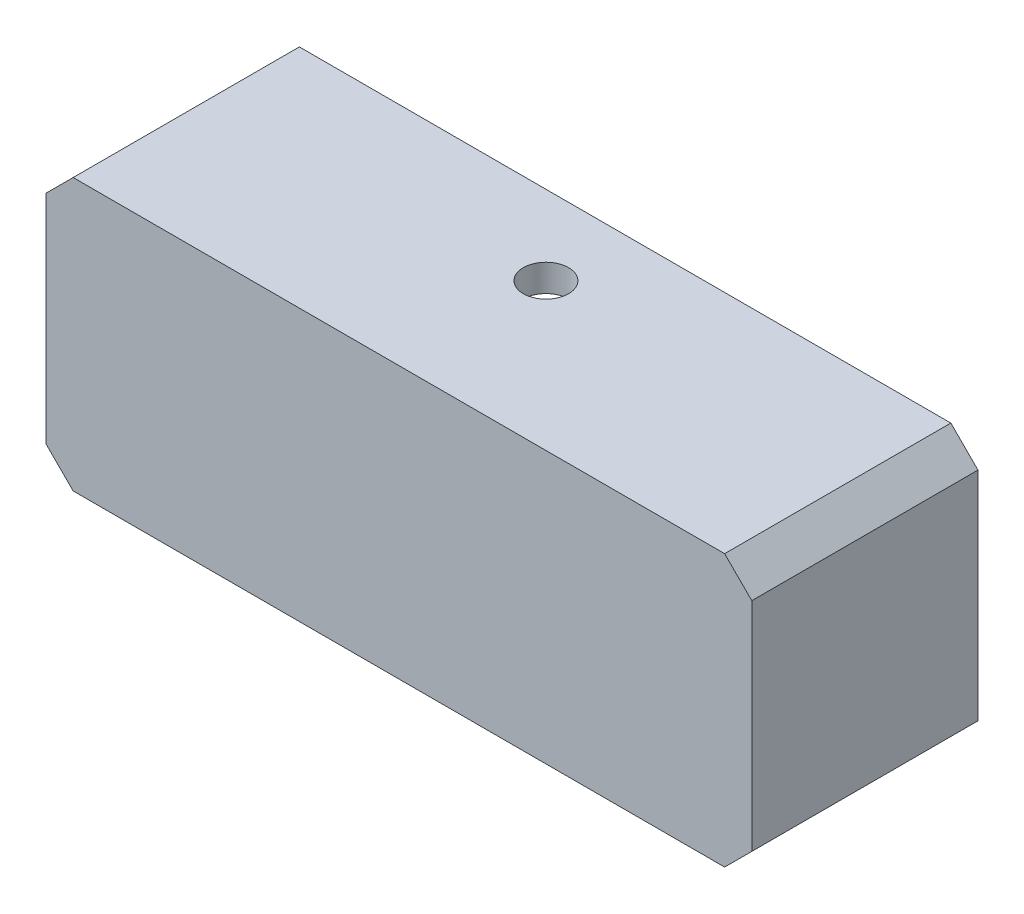
ISO-10303-21;
HEADER;
FILE_DESCRIPTION(('STEP AP214'),'2;1');
FILE_NAME('part.step','',(''),(''),'','','');
FILE_SCHEMA(('AUTOMOTIVE_DESIGN { 1 0 10303 214 1 1 1 1 }'));
ENDSEC;
DATA;
#1=APPLICATION_CONTEXT('core data for automotive mechanical design processes');
#2=APPLICATION_PROTOCOL_DEFINITION('international standard','automotive_design',2000,#1);
#3=PRODUCT_CONTEXT('',#1,'mechanical');
#4=PRODUCT('Part','Part','',(#3));
#5=PRODUCT_RELATED_PRODUCT_CATEGORY('part','',(#4));
#6=PRODUCT_DEFINITION_FORMATION('','',#4);
#7=PRODUCT_DEFINITION_CONTEXT('part definition',#1,'design');
#8=PRODUCT_DEFINITION('design','',#6,#7);
#9=PRODUCT_DEFINITION_SHAPE('','',#8);
#10=(LENGTH_UNIT() NAMED_UNIT(*) SI_UNIT(.MILLI.,.METRE.));
#11=(NAMED_UNIT(*) PLANE_ANGLE_UNIT() SI_UNIT($,.RADIAN.));
#12=(NAMED_UNIT(*) SI_UNIT($,.STERADIAN.) SOLID_ANGLE_UNIT());
#13=UNCERTAINTY_MEASURE_WITH_UNIT(LENGTH_MEASURE(1.E-05),#10,'distance_accuracy_value','');
#14=(GEOMETRIC_REPRESENTATION_CONTEXT(3) GLOBAL_UNCERTAINTY_ASSIGNED_CONTEXT((#13)) GLOBAL_UNIT_ASSIGNED_CONTEXT((#10,
#11,#12)) REPRESENTATION_CONTEXT('',''));
#15=CARTESIAN_POINT('',(0.,0.,0.));
#16=DIRECTION('',(0.,0.,1.));
#17=DIRECTION('',(1.,0.,0.));
#18=AXIS2_PLACEMENT_3D('',#15,#16,#17);
#19=CARTESIAN_POINT('',(0.,0.,0.));
#20=DIRECTION('',(0.,0.,-1.));
#21=DIRECTION('',(-1.,0.,0.));
#22=AXIS2_PLACEMENT_3D('',#19,#20,#21);
#23=PLANE('',#22);
#24=DIRECTION('',(-1.,0.,0.));
#25=VECTOR('',#24,1.);
#26=CARTESIAN_POINT('',(-1.,24.,0.));
#27=LINE('',#26,#25);
#28=CARTESIAN_POINT('',(71.,24.,0.));
#29=VERTEX_POINT('',#28);
#30=CARTESIAN_POINT('',(-1.,24.,0.));
#31=VERTEX_POINT('',#30);
#32=EDGE_CURVE('E243',#29,#31,#27,.T.);
#33=ORIENTED_EDGE('',*,*,#32,.F.);
#34=DIRECTION('',(0.,1.,0.));
#35=VECTOR('',#34,1.);
#36=CARTESIAN_POINT('',(71.,8.99999999999999,0.));
#37=LINE('',#36,#35);
#38=CARTESIAN_POINT('',(71.,9.00000000000001,0.));
#39=VERTEX_POINT('',#38);
#40=EDGE_CURVE('E227',#39,#29,#37,.T.);
#41=ORIENTED_EDGE('',*,*,#40,.F.);
#42=DIRECTION('',(1.,0.,0.));
#43=VECTOR('',#42,1.);
#44=CARTESIAN_POINT('',(58.0000000000001,9.00000000000001,0.));
#45=LINE('',#44,#43);
#46=CARTESIAN_POINT('',(58.0000000000001,9.00000000000001,0.));
#47=VERTEX_POINT('',#46);
#48=EDGE_CURVE('E340',#47,#39,#45,.T.);
#49=ORIENTED_EDGE('',*,*,#48,.F.);
#50=DIRECTION('',(0.,1.,0.));
#51=VECTOR('',#50,1.);
#52=CARTESIAN_POINT('',(58.0000000000001,-3.,0.));
#53=LINE('',#52,#51);
#54=CARTESIAN_POINT('',(58.0000000000001,0.,0.));
#55=VERTEX_POINT('',#54);
#56=EDGE_CURVE('E343',#55,#47,#53,.T.);
#57=ORIENTED_EDGE('',*,*,#56,.F.);
#58=DIRECTION('',(1.,0.,0.));
#59=VECTOR('',#58,1.);
#60=CARTESIAN_POINT('',(11.9999999999999,0.,0.));
#61=LINE('',#60,#59);
#62=CARTESIAN_POINT('',(11.9999999999999,0.,0.));
#63=VERTEX_POINT('',#62);
#64=EDGE_CURVE('E252',#63,#55,#61,.T.);
#65=ORIENTED_EDGE('',*,*,#64,.F.);
#66=DIRECTION('',(0.,1.,0.));
#67=VECTOR('',#66,1.);
#68=CARTESIAN_POINT('',(11.9999999999999,-3.,0.));
#69=LINE('',#68,#67);
#70=CARTESIAN_POINT('',(11.9999999999999,9.,0.));
#71=VERTEX_POINT('',#70);
#72=EDGE_CURVE('E299',#63,#71,#69,.T.);
#73=ORIENTED_EDGE('',*,*,#72,.T.);
#74=DIRECTION('',(-1.,0.,0.));
#75=VECTOR('',#74,1.);
#76=CARTESIAN_POINT('',(11.9999999999999,9.,0.));
#77=LINE('',#76,#75);
#78=CARTESIAN_POINT('',(-1.,9.,0.));
#79=VERTEX_POINT('',#78);
#80=EDGE_CURVE('E295',#71,#79,#77,.T.);
#81=ORIENTED_EDGE('',*,*,#80,.T.);
#82=DIRECTION('',(0.,-1.,0.));
#83=VECTOR('',#82,1.);
#84=CARTESIAN_POINT('',(-1.,9.,0.));
#85=LINE('',#84,#83);
#86=EDGE_CURVE('E246',#31,#79,#85,.T.);
#87=ORIENTED_EDGE('',*,*,#86,.F.);
#88=EDGE_LOOP('',(#33,#41,#49,#57,#65,#73,#81,#87));
#89=FACE_BOUND('',#88,.T.);
#90=ADVANCED_FACE('F45',(#89),#23,.T.);
#91=CARTESIAN_POINT('',(58.0000000000001,9.00000000000001,-22.));
#92=DIRECTION('',(0.,-1.,0.));
#93=DIRECTION('',(1.,0.,0.));
#94=AXIS2_PLACEMENT_3D('',#91,#92,#93);
#95=PLANE('',#94);
#96=CARTESIAN_POINT('',(65.4500000000001,9.00000000000001,-8.));
#97=DIRECTION('',(0.,-1.,0.));
#98=DIRECTION('',(1.,0.,0.));
#99=AXIS2_PLACEMENT_3D('',#96,#97,#98);
#100=CIRCLE('',#99,1.65);
#101=CARTESIAN_POINT('',(67.1000000000001,9.00000000000001,-8.));
#102=VERTEX_POINT('',#101);
#103=EDGE_CURVE('E404',#102,#102,#100,.T.);
#104=ORIENTED_EDGE('',*,*,#103,.T.);
#105=EDGE_LOOP('',(#104));
#106=FACE_BOUND('',#105,.T.);
#107=DIRECTION('',(0.,0.,1.));
#108=VECTOR('',#107,1.);
#109=CARTESIAN_POINT('',(71.,8.99999999999999,-22.));
#110=LINE('',#109,#108);
#111=CARTESIAN_POINT('',(71.,9.00000000000001,-22.));
#112=VERTEX_POINT('',#111);
#113=EDGE_CURVE('E230',#112,#39,#110,.T.);
#114=ORIENTED_EDGE('',*,*,#113,.F.);
#115=DIRECTION('',(1.,0.,0.));
#116=VECTOR('',#115,1.);
#117=CARTESIAN_POINT('',(58.0000000000001,9.00000000000001,-22.));
#118=LINE('',#117,#116);
#119=CARTESIAN_POINT('',(58.0000000000001,9.00000000000001,-22.));
#120=VERTEX_POINT('',#119);
#121=EDGE_CURVE('E218',#120,#112,#118,.T.);
#122=ORIENTED_EDGE('',*,*,#121,.F.);
#123=DIRECTION('',(0.,0.,1.));
#124=VECTOR('',#123,1.);
#125=CARTESIAN_POINT('',(58.0000000000001,9.00000000000001,-22.));
#126=LINE('',#125,#124);
#127=EDGE_CURVE('E349',#120,#47,#126,.T.);
#128=ORIENTED_EDGE('',*,*,#127,.T.);
#129=ORIENTED_EDGE('',*,*,#48,.T.);
#130=EDGE_LOOP('',(#114,#122,#128,#129));
#131=FACE_BOUND('',#130,.T.);
#132=ADVANCED_FACE('F479',(#106,#131),#95,.F.);
#133=CARTESIAN_POINT('',(11.9999999999999,9.,-22.));
#134=DIRECTION('',(0.,1.,0.));
#135=DIRECTION('',(-1.,0.,0.));
#136=AXIS2_PLACEMENT_3D('',#133,#134,#135);
#137=PLANE('',#136);
#138=CARTESIAN_POINT('',(4.54999999999994,9.,-8.));
#139=DIRECTION('',(0.,1.,0.));
#140=DIRECTION('',(-1.,0.,0.));
#141=AXIS2_PLACEMENT_3D('',#138,#139,#140);
#142=CIRCLE('',#141,1.65);
#143=CARTESIAN_POINT('',(2.89999999999994,9.,-8.));
#144=VERTEX_POINT('',#143);
#145=EDGE_CURVE('E422',#144,#144,#142,.F.);
#146=ORIENTED_EDGE('',*,*,#145,.T.);
#147=EDGE_LOOP('',(#146));
#148=FACE_BOUND('',#147,.T.);
#149=DIRECTION('',(-1.,0.,0.));
#150=VECTOR('',#149,1.);
#151=CARTESIAN_POINT('',(11.9999999999999,9.,-22.));
#152=LINE('',#151,#150);
#153=CARTESIAN_POINT('',(11.9999999999999,9.,-22.));
#154=VERTEX_POINT('',#153);
#155=CARTESIAN_POINT('',(-1.,9.,-22.));
#156=VERTEX_POINT('',#155);
#157=EDGE_CURVE('E296',#154,#156,#152,.T.);
#158=ORIENTED_EDGE('',*,*,#157,.T.);
#159=DIRECTION('',(0.,0.,1.));
#160=VECTOR('',#159,1.);
#161=CARTESIAN_POINT('',(-1.,9.,-22.));
#162=LINE('',#161,#160);
#163=EDGE_CURVE('E238',#156,#79,#162,.T.);
#164=ORIENTED_EDGE('',*,*,#163,.T.);
#165=ORIENTED_EDGE('',*,*,#80,.F.);
#166=DIRECTION('',(0.,0.,1.));
#167=VECTOR('',#166,1.);
#168=CARTESIAN_POINT('',(11.9999999999999,9.,-22.));
#169=LINE('',#168,#167);
#170=EDGE_CURVE('E304',#154,#71,#169,.T.);
#171=ORIENTED_EDGE('',*,*,#170,.F.);
#172=EDGE_LOOP('',(#158,#164,#165,#171));
#173=FACE_BOUND('',#172,.T.);
#174=ADVANCED_FACE('F489',(#148,#173),#137,.T.);
#175=CARTESIAN_POINT('',(58.0000000000001,-3.,-22.));
#176=DIRECTION('',(1.,0.,0.));
#177=DIRECTION('',(0.,0.,-1.));
#178=AXIS2_PLACEMENT_3D('',#175,#176,#177);
#179=PLANE('',#178);
#180=DIRECTION('',(0.,0.,1.));
#181=VECTOR('',#180,1.);
#182=CARTESIAN_POINT('',(58.0000000000001,0.,-22.));
#183=LINE('',#182,#181);
#184=CARTESIAN_POINT('',(58.0000000000001,0.,-22.));
#185=VERTEX_POINT('',#184);
#186=EDGE_CURVE('E256',#185,#55,#183,.T.);
#187=ORIENTED_EDGE('',*,*,#186,.T.);
#188=ORIENTED_EDGE('',*,*,#56,.T.);
#189=ORIENTED_EDGE('',*,*,#127,.F.);
#190=DIRECTION('',(0.,1.,0.));
#191=VECTOR('',#190,1.);
#192=CARTESIAN_POINT('',(58.0000000000001,-3.,-22.));
#193=LINE('',#192,#191);
#194=EDGE_CURVE('E347',#185,#120,#193,.T.);
#195=ORIENTED_EDGE('',*,*,#194,.F.);
#196=EDGE_LOOP('',(#187,#188,#189,#195));
#197=FACE_BOUND('',#196,.T.);
#198=ADVANCED_FACE('F540',(#197),#179,.F.);
#199=CARTESIAN_POINT('',(11.9999999999999,-3.,-22.));
#200=DIRECTION('',(1.,0.,0.));
#201=DIRECTION('',(0.,1.,0.));
#202=AXIS2_PLACEMENT_3D('',#199,#200,#201);
#203=PLANE('',#202);
#204=ORIENTED_EDGE('',*,*,#72,.F.);
#205=DIRECTION('',(0.,0.,1.));
#206=VECTOR('',#205,1.);
#207=CARTESIAN_POINT('',(11.9999999999999,0.,-22.));
#208=LINE('',#207,#206);
#209=CARTESIAN_POINT('',(11.9999999999999,0.,-22.));
#210=VERTEX_POINT('',#209);
#211=EDGE_CURVE('E260',#210,#63,#208,.T.);
#212=ORIENTED_EDGE('',*,*,#211,.F.);
#213=DIRECTION('',(0.,1.,0.));
#214=VECTOR('',#213,1.);
#215=CARTESIAN_POINT('',(11.9999999999999,-3.,-22.));
#216=LINE('',#215,#214);
#217=EDGE_CURVE('E298',#210,#154,#216,.T.);
#218=ORIENTED_EDGE('',*,*,#217,.T.);
#219=ORIENTED_EDGE('',*,*,#170,.T.);
#220=EDGE_LOOP('',(#204,#212,#218,#219));
#221=FACE_BOUND('',#220,.T.);
#222=ADVANCED_FACE('F475',(#221),#203,.T.);
#223=CARTESIAN_POINT('',(-4.,27.,0.));
#224=DIRECTION('',(-1.,0.,0.));
#225=DIRECTION('',(0.,-1.,0.));
#226=AXIS2_PLACEMENT_3D('',#223,#224,#225);
#227=PLANE('',#226);
#228=DIRECTION('',(0.,-1.,0.));
#229=VECTOR('',#228,1.);
#230=CARTESIAN_POINT('',(-4.,27.,3.));
#231=LINE('',#230,#229);
#232=CARTESIAN_POINT('',(-4.,24.,3.));
#233=VERTEX_POINT('',#232);
#234=CARTESIAN_POINT('',(-4.,0.,3.));
#235=VERTEX_POINT('',#234);
#236=EDGE_CURVE('E355',#233,#235,#231,.T.);
#237=ORIENTED_EDGE('',*,*,#236,.F.);
#238=DIRECTION('',(0.,0.,-1.));
#239=VECTOR('',#238,1.);
#240=CARTESIAN_POINT('',(-4.,24.,0.));
#241=LINE('',#240,#239);
#242=CARTESIAN_POINT('',(-4.00000000000001,24.,-22.));
#243=VERTEX_POINT('',#242);
#244=EDGE_CURVE('E383',#233,#243,#241,.T.);
#245=ORIENTED_EDGE('',*,*,#244,.T.);
#246=DIRECTION('',(0.,-1.,0.));
#247=VECTOR('',#246,1.);
#248=CARTESIAN_POINT('',(-4.,9.,-22.));
#249=LINE('',#248,#247);
#250=CARTESIAN_POINT('',(-4.,0.,-22.));
#251=VERTEX_POINT('',#250);
#252=EDGE_CURVE('E301',#243,#251,#249,.T.);
#253=ORIENTED_EDGE('',*,*,#252,.T.);
#254=DIRECTION('',(0.,0.,1.));
#255=VECTOR('',#254,1.);
#256=CARTESIAN_POINT('',(-4.,0.,0.));
#257=LINE('',#256,#255);
#258=EDGE_CURVE('E380',#251,#235,#257,.T.);
#259=ORIENTED_EDGE('',*,*,#258,.T.);
#260=EDGE_LOOP('',(#237,#245,#253,#259));
#261=FACE_BOUND('',#260,.T.);
#262=ADVANCED_FACE('F460',(#261),#227,.T.);
#263=CARTESIAN_POINT('',(-4.,27.,0.));
#264=DIRECTION('',(0.,1.,0.));
#265=DIRECTION('',(0.,0.,1.));
#266=AXIS2_PLACEMENT_3D('',#263,#264,#265);
#267=PLANE('',#266);
#268=CARTESIAN_POINT('',(35.,27.,-13.25));
#269=DIRECTION('',(0.,-1.,0.));
#270=DIRECTION('',(1.,0.,0.));
#271=AXIS2_PLACEMENT_3D('',#268,#269,#270);
#272=CIRCLE('',#271,2.50000000000005);
#273=CARTESIAN_POINT('',(37.5000000000001,27.,-13.25));
#274=VERTEX_POINT('',#273);
#275=EDGE_CURVE('E400',#274,#274,#272,.T.);
#276=ORIENTED_EDGE('',*,*,#275,.T.);
#277=EDGE_LOOP('',(#276));
#278=FACE_BOUND('',#277,.T.);
#279=DIRECTION('',(1.,0.,0.));
#280=VECTOR('',#279,1.);
#281=CARTESIAN_POINT('',(-4.,27.,-22.));
#282=LINE('',#281,#280);
#283=CARTESIAN_POINT('',(-0.999999999999997,27.,-22.));
#284=VERTEX_POINT('',#283);
#285=CARTESIAN_POINT('',(71.,27.,-22.));
#286=VERTEX_POINT('',#285);
#287=EDGE_CURVE('E221',#284,#286,#282,.T.);
#288=ORIENTED_EDGE('',*,*,#287,.F.);
#289=DIRECTION('',(0.,0.,1.));
#290=VECTOR('',#289,1.);
#291=CARTESIAN_POINT('',(-0.999999999999997,27.,0.));
#292=LINE('',#291,#290);
#293=CARTESIAN_POINT('',(-0.999999999999997,27.,3.));
#294=VERTEX_POINT('',#293);
#295=EDGE_CURVE('E369',#284,#294,#292,.T.);
#296=ORIENTED_EDGE('',*,*,#295,.T.);
#297=DIRECTION('',(-1.,0.,0.));
#298=VECTOR('',#297,1.);
#299=CARTESIAN_POINT('',(-4.,27.,3.));
#300=LINE('',#299,#298);
#301=CARTESIAN_POINT('',(71.,27.,3.));
#302=VERTEX_POINT('',#301);
#303=EDGE_CURVE('E364',#302,#294,#300,.T.);
#304=ORIENTED_EDGE('',*,*,#303,.F.);
#305=DIRECTION('',(0.,0.,-1.));
#306=VECTOR('',#305,1.);
#307=CARTESIAN_POINT('',(71.,27.,0.));
#308=LINE('',#307,#306);
#309=EDGE_CURVE('E367',#302,#286,#308,.T.);
#310=ORIENTED_EDGE('',*,*,#309,.T.);
#311=EDGE_LOOP('',(#288,#296,#304,#310));
#312=FACE_BOUND('',#311,.T.);
#313=ADVANCED_FACE('F464',(#278,#312),#267,.T.);
#314=CARTESIAN_POINT('',(74.,27.,0.));
#315=DIRECTION('',(1.,0.,0.));
#316=DIRECTION('',(0.,0.,-1.));
#317=AXIS2_PLACEMENT_3D('',#314,#315,#316);
#318=PLANE('',#317);
#319=DIRECTION('',(0.,1.,0.));
#320=VECTOR('',#319,1.);
#321=CARTESIAN_POINT('',(74.,27.,3.));
#322=LINE('',#321,#320);
#323=CARTESIAN_POINT('',(74.,0.,3.));
#324=VERTEX_POINT('',#323);
#325=CARTESIAN_POINT('',(74.,24.,3.));
#326=VERTEX_POINT('',#325);
#327=EDGE_CURVE('E361',#324,#326,#322,.T.);
#328=ORIENTED_EDGE('',*,*,#327,.F.);
#329=DIRECTION('',(0.,0.,-1.));
#330=VECTOR('',#329,1.);
#331=CARTESIAN_POINT('',(74.,0.,0.));
#332=LINE('',#331,#330);
#333=CARTESIAN_POINT('',(74.,0.,-22.));
#334=VERTEX_POINT('',#333);
#335=EDGE_CURVE('E11',#324,#334,#332,.T.);
#336=ORIENTED_EDGE('',*,*,#335,.T.);
#337=DIRECTION('',(0.,-1.,0.));
#338=VECTOR('',#337,1.);
#339=CARTESIAN_POINT('',(74.,9.00000000000001,-22.));
#340=LINE('',#339,#338);
#341=CARTESIAN_POINT('',(74.,24.,-22.));
#342=VERTEX_POINT('',#341);
#343=EDGE_CURVE('E342',#342,#334,#340,.T.);
#344=ORIENTED_EDGE('',*,*,#343,.F.);
#345=DIRECTION('',(0.,0.,1.));
#346=VECTOR('',#345,1.);
#347=CARTESIAN_POINT('',(74.,24.,0.));
#348=LINE('',#347,#346);
#349=EDGE_CURVE('E55',#342,#326,#348,.T.);
#350=ORIENTED_EDGE('',*,*,#349,.T.);
#351=EDGE_LOOP('',(#328,#336,#344,#350));
#352=FACE_BOUND('',#351,.T.);
#353=ADVANCED_FACE('F445',(#352),#318,.T.);
#354=CARTESIAN_POINT('',(-4.,-3.,0.));
#355=DIRECTION('',(0.,-1.,0.));
#356=DIRECTION('',(0.,0.,-1.));
#357=AXIS2_PLACEMENT_3D('',#354,#355,#356);
#358=PLANE('',#357);
#359=CARTESIAN_POINT('',(65.4500000000001,-3.,-8.));
#360=DIRECTION('',(0.,-1.,0.));
#361=DIRECTION('',(0.,0.,-1.));
#362=AXIS2_PLACEMENT_3D('',#359,#360,#361);
#363=CIRCLE('',#362,1.65);
#364=CARTESIAN_POINT('',(65.4500000000001,-3.,-9.65));
#365=VERTEX_POINT('',#364);
#366=EDGE_CURVE('E411',#365,#365,#363,.T.);
#367=ORIENTED_EDGE('',*,*,#366,.F.);
#368=EDGE_LOOP('',(#367));
#369=FACE_BOUND('',#368,.T.);
#370=CARTESIAN_POINT('',(4.54999999999994,-3.,-8.));
#371=DIRECTION('',(0.,-1.,0.));
#372=DIRECTION('',(0.,0.,-1.));
#373=AXIS2_PLACEMENT_3D('',#370,#371,#372);
#374=CIRCLE('',#373,1.65);
#375=CARTESIAN_POINT('',(4.54999999999994,-3.,-9.65));
#376=VERTEX_POINT('',#375);
#377=EDGE_CURVE('E408',#376,#376,#374,.F.);
#378=ORIENTED_EDGE('',*,*,#377,.T.);
#379=EDGE_LOOP('',(#378));
#380=FACE_BOUND('',#379,.T.);
#381=CARTESIAN_POINT('',(35.,-3.00000000000001,-13.25));
#382=DIRECTION('',(0.,-1.,0.));
#383=DIRECTION('',(1.,0.,0.));
#384=AXIS2_PLACEMENT_3D('',#381,#382,#383);
#385=CIRCLE('',#384,2.50000000000005);
#386=CARTESIAN_POINT('',(37.5000000000001,-3.00000000000001,-13.25));
#387=VERTEX_POINT('',#386);
#388=EDGE_CURVE('E425',#387,#387,#385,.T.);
#389=ORIENTED_EDGE('',*,*,#388,.F.);
#390=EDGE_LOOP('',(#389));
#391=FACE_BOUND('',#390,.T.);
#392=DIRECTION('',(1.,0.,0.));
#393=VECTOR('',#392,1.);
#394=CARTESIAN_POINT('',(-4.,-3.,3.));
#395=LINE('',#394,#393);
#396=CARTESIAN_POINT('',(-0.999999999999966,-3.,3.));
#397=VERTEX_POINT('',#396);
#398=CARTESIAN_POINT('',(71.,-3.,3.));
#399=VERTEX_POINT('',#398);
#400=EDGE_CURVE('E358',#397,#399,#395,.T.);
#401=ORIENTED_EDGE('',*,*,#400,.F.);
#402=DIRECTION('',(0.,0.,-1.));
#403=VECTOR('',#402,1.);
#404=CARTESIAN_POINT('',(-0.999999999999966,-3.,0.));
#405=LINE('',#404,#403);
#406=CARTESIAN_POINT('',(-0.999999999999973,-3.,-22.));
#407=VERTEX_POINT('',#406);
#408=EDGE_CURVE('E63',#397,#407,#405,.T.);
#409=ORIENTED_EDGE('',*,*,#408,.T.);
#410=DIRECTION('',(-1.,0.,0.));
#411=VECTOR('',#410,1.);
#412=CARTESIAN_POINT('',(74.,-3.,-22.));
#413=LINE('',#412,#411);
#414=CARTESIAN_POINT('',(71.,-3.,-22.));
#415=VERTEX_POINT('',#414);
#416=EDGE_CURVE('E345',#415,#407,#413,.T.);
#417=ORIENTED_EDGE('',*,*,#416,.F.);
#418=DIRECTION('',(0.,0.,1.));
#419=VECTOR('',#418,1.);
#420=CARTESIAN_POINT('',(71.,-3.,0.));
#421=LINE('',#420,#419);
#422=EDGE_CURVE('E392',#415,#399,#421,.T.);
#423=ORIENTED_EDGE('',*,*,#422,.T.);
#424=EDGE_LOOP('',(#401,#409,#417,#423));
#425=FACE_BOUND('',#424,.T.);
#426=ADVANCED_FACE('F453',(#369,#380,#391,#425),#358,.T.);
#427=CARTESIAN_POINT('',(0.,0.,3.));
#428=DIRECTION('',(0.,0.,-1.));
#429=DIRECTION('',(-1.,0.,0.));
#430=AXIS2_PLACEMENT_3D('',#427,#428,#429);
#431=PLANE('',#430);
#432=ORIENTED_EDGE('',*,*,#303,.T.);
#433=DIRECTION('',(0.707106781186546,0.707106781186549,0.));
#434=VECTOR('',#433,1.);
#435=CARTESIAN_POINT('',(-0.999999999999997,27.,3.));
#436=LINE('',#435,#434);
#437=EDGE_CURVE('E378',#294,#233,#436,.F.);
#438=ORIENTED_EDGE('',*,*,#437,.T.);
#439=ORIENTED_EDGE('',*,*,#236,.T.);
#440=DIRECTION('',(-0.707106781186549,0.707106781186546,0.));
#441=VECTOR('',#440,1.);
#442=CARTESIAN_POINT('',(-4.,0.,3.));
#443=LINE('',#442,#441);
#444=EDGE_CURVE('E376',#235,#397,#443,.F.);
#445=ORIENTED_EDGE('',*,*,#444,.T.);
#446=ORIENTED_EDGE('',*,*,#400,.T.);
#447=DIRECTION('',(-0.707106781186546,-0.707106781186549,0.));
#448=VECTOR('',#447,1.);
#449=CARTESIAN_POINT('',(71.,-3.,3.));
#450=LINE('',#449,#448);
#451=EDGE_CURVE('E374',#399,#324,#450,.F.);
#452=ORIENTED_EDGE('',*,*,#451,.T.);
#453=ORIENTED_EDGE('',*,*,#327,.T.);
#454=DIRECTION('',(0.707106781186548,-0.707106781186548,0.));
#455=VECTOR('',#454,1.);
#456=CARTESIAN_POINT('',(74.,24.,3.));
#457=LINE('',#456,#455);
#458=EDGE_CURVE('E372',#326,#302,#457,.F.);
#459=ORIENTED_EDGE('',*,*,#458,.T.);
#460=EDGE_LOOP('',(#432,#438,#439,#445,#446,#452,#453,#459));
#461=FACE_BOUND('',#460,.T.);
#462=ADVANCED_FACE('F448',(#461),#431,.F.);
#463=CARTESIAN_POINT('',(0.,0.,-22.));
#464=DIRECTION('',(0.,0.,-1.));
#465=DIRECTION('',(-1.,0.,0.));
#466=AXIS2_PLACEMENT_3D('',#463,#464,#465);
#467=PLANE('',#466);
#468=ORIENTED_EDGE('',*,*,#121,.T.);
#469=DIRECTION('',(0.,1.,0.));
#470=VECTOR('',#469,1.);
#471=CARTESIAN_POINT('',(71.,8.99999999999999,-22.));
#472=LINE('',#471,#470);
#473=CARTESIAN_POINT('',(71.,24.,-22.));
#474=VERTEX_POINT('',#473);
#475=EDGE_CURVE('E210',#112,#474,#472,.T.);
#476=ORIENTED_EDGE('',*,*,#475,.T.);
#477=DIRECTION('',(-1.,0.,0.));
#478=VECTOR('',#477,1.);
#479=CARTESIAN_POINT('',(-1.,24.,-22.));
#480=LINE('',#479,#478);
#481=CARTESIAN_POINT('',(-1.,24.,-22.));
#482=VERTEX_POINT('',#481);
#483=EDGE_CURVE('E215',#474,#482,#480,.T.);
#484=ORIENTED_EDGE('',*,*,#483,.T.);
#485=DIRECTION('',(0.,-1.,0.));
#486=VECTOR('',#485,1.);
#487=CARTESIAN_POINT('',(-1.,9.,-22.));
#488=LINE('',#487,#486);
#489=EDGE_CURVE('E236',#482,#156,#488,.T.);
#490=ORIENTED_EDGE('',*,*,#489,.T.);
#491=ORIENTED_EDGE('',*,*,#157,.F.);
#492=ORIENTED_EDGE('',*,*,#217,.F.);
#493=DIRECTION('',(1.,0.,0.));
#494=VECTOR('',#493,1.);
#495=CARTESIAN_POINT('',(11.9999999999999,0.,-22.));
#496=LINE('',#495,#494);
#497=EDGE_CURVE('E253',#210,#185,#496,.T.);
#498=ORIENTED_EDGE('',*,*,#497,.T.);
#499=ORIENTED_EDGE('',*,*,#194,.T.);
#500=EDGE_LOOP('',(#468,#476,#484,#490,#491,#492,#498,#499));
#501=FACE_BOUND('',#500,.T.);
#502=ORIENTED_EDGE('',*,*,#252,.F.);
#503=DIRECTION('',(-0.707106781186546,-0.707106781186549,0.));
#504=VECTOR('',#503,1.);
#505=CARTESIAN_POINT('',(-14.,13.9999999999999,-22.));
#506=LINE('',#505,#504);
#507=EDGE_CURVE('E390',#243,#284,#506,.F.);
#508=ORIENTED_EDGE('',*,*,#507,.T.);
#509=ORIENTED_EDGE('',*,*,#287,.T.);
#510=DIRECTION('',(-0.707106781186548,0.707106781186548,0.));
#511=VECTOR('',#510,1.);
#512=CARTESIAN_POINT('',(49.,49.,-22.));
#513=LINE('',#512,#511);
#514=EDGE_CURVE('E385',#286,#342,#513,.F.);
#515=ORIENTED_EDGE('',*,*,#514,.T.);
#516=ORIENTED_EDGE('',*,*,#343,.T.);
#517=DIRECTION('',(0.707106781186546,0.707106781186549,0.));
#518=VECTOR('',#517,1.);
#519=CARTESIAN_POINT('',(37.0000000000002,-37.,-22.));
#520=LINE('',#519,#518);
#521=EDGE_CURVE('E70',#334,#415,#520,.F.);
#522=ORIENTED_EDGE('',*,*,#521,.T.);
#523=ORIENTED_EDGE('',*,*,#416,.T.);
#524=DIRECTION('',(0.707106781186549,-0.707106781186546,0.));
#525=VECTOR('',#524,1.);
#526=CARTESIAN_POINT('',(-1.99999999999998,-1.99999999999999,-22.));
#527=LINE('',#526,#525);
#528=EDGE_CURVE('E388',#407,#251,#527,.F.);
#529=ORIENTED_EDGE('',*,*,#528,.T.);
#530=EDGE_LOOP('',(#502,#508,#509,#515,#516,#522,#523,#529));
#531=FACE_BOUND('',#530,.T.);
#532=DIRECTION('',(1.,0.,0.));
#533=VECTOR('',#532,1.);
#534=CARTESIAN_POINT('',(60.9000000000001,6.50000000000001,-22.));
#535=LINE('',#534,#533);
#536=CARTESIAN_POINT('',(60.9000000000001,6.50000000000001,-22.));
#537=VERTEX_POINT('',#536);
#538=CARTESIAN_POINT('',(70.0000000000001,6.50000000000001,-22.));
#539=VERTEX_POINT('',#538);
#540=EDGE_CURVE('E313',#537,#539,#535,.T.);
#541=ORIENTED_EDGE('',*,*,#540,.F.);
#542=DIRECTION('',(0.,1.,0.));
#543=VECTOR('',#542,1.);
#544=CARTESIAN_POINT('',(60.9000000000001,6.50000000000001,-22.));
#545=LINE('',#544,#543);
#546=CARTESIAN_POINT('',(60.9000000000001,0.,-22.));
#547=VERTEX_POINT('',#546);
#548=EDGE_CURVE('E311',#547,#537,#545,.T.);
#549=ORIENTED_EDGE('',*,*,#548,.F.);
#550=DIRECTION('',(-1.,0.,0.));
#551=VECTOR('',#550,1.);
#552=CARTESIAN_POINT('',(60.9000000000001,0.,-22.));
#553=LINE('',#552,#551);
#554=CARTESIAN_POINT('',(70.0000000000001,0.,-22.));
#555=VERTEX_POINT('',#554);
#556=EDGE_CURVE('E319',#555,#547,#553,.T.);
#557=ORIENTED_EDGE('',*,*,#556,.F.);
#558=DIRECTION('',(0.,-1.,0.));
#559=VECTOR('',#558,1.);
#560=CARTESIAN_POINT('',(70.0000000000001,6.50000000000001,-22.));
#561=LINE('',#560,#559);
#562=EDGE_CURVE('E316',#539,#555,#561,.T.);
#563=ORIENTED_EDGE('',*,*,#562,.F.);
#564=EDGE_LOOP('',(#541,#549,#557,#563));
#565=FACE_BOUND('',#564,.T.);
#566=DIRECTION('',(0.,1.,0.));
#567=VECTOR('',#566,1.);
#568=CARTESIAN_POINT('',(9.09999999999994,6.50000000000001,-22.));
#569=LINE('',#568,#567);
#570=CARTESIAN_POINT('',(9.09999999999994,0.,-22.));
#571=VERTEX_POINT('',#570);
#572=CARTESIAN_POINT('',(9.09999999999994,6.50000000000001,-22.));
#573=VERTEX_POINT('',#572);
#574=EDGE_CURVE('E264',#571,#573,#569,.T.);
#575=ORIENTED_EDGE('',*,*,#574,.T.);
#576=DIRECTION('',(-1.,0.,0.));
#577=VECTOR('',#576,1.);
#578=CARTESIAN_POINT('',(9.09999999999994,6.50000000000001,-22.));
#579=LINE('',#578,#577);
#580=CARTESIAN_POINT('',(0.,6.50000000000001,-22.));
#581=VERTEX_POINT('',#580);
#582=EDGE_CURVE('E274',#573,#581,#579,.T.);
#583=ORIENTED_EDGE('',*,*,#582,.T.);
#584=DIRECTION('',(0.,-1.,0.));
#585=VECTOR('',#584,1.);
#586=CARTESIAN_POINT('',(0.,6.50000000000001,-22.));
#587=LINE('',#586,#585);
#588=CARTESIAN_POINT('',(0.,0.,-22.));
#589=VERTEX_POINT('',#588);
#590=EDGE_CURVE('E271',#581,#589,#587,.T.);
#591=ORIENTED_EDGE('',*,*,#590,.T.);
#592=DIRECTION('',(1.,0.,0.));
#593=VECTOR('',#592,1.);
#594=CARTESIAN_POINT('',(9.09999999999994,0.,-22.));
#595=LINE('',#594,#593);
#596=EDGE_CURVE('E267',#589,#571,#595,.T.);
#597=ORIENTED_EDGE('',*,*,#596,.T.);
#598=EDGE_LOOP('',(#575,#583,#591,#597));
#599=FACE_BOUND('',#598,.T.);
#600=ADVANCED_FACE('F212',(#501,#531,#565,#599),#467,.T.);
#601=CARTESIAN_POINT('',(60.9000000000001,6.50000000000001,-22.));
#602=DIRECTION('',(1.,0.,0.));
#603=DIRECTION('',(0.,0.,-1.));
#604=AXIS2_PLACEMENT_3D('',#601,#602,#603);
#605=PLANE('',#604);
#606=DIRECTION('',(0.,1.,0.));
#607=VECTOR('',#606,1.);
#608=CARTESIAN_POINT('',(60.9000000000001,6.50000000000001,0.));
#609=LINE('',#608,#607);
#610=CARTESIAN_POINT('',(60.9000000000001,0.,0.));
#611=VERTEX_POINT('',#610);
#612=CARTESIAN_POINT('',(60.9000000000001,6.50000000000001,0.));
#613=VERTEX_POINT('',#612);
#614=EDGE_CURVE('E310',#611,#613,#609,.T.);
#615=ORIENTED_EDGE('',*,*,#614,.F.);
#616=DIRECTION('',(0.,0.,1.));
#617=VECTOR('',#616,1.);
#618=CARTESIAN_POINT('',(60.9000000000001,0.,-22.));
#619=LINE('',#618,#617);
#620=EDGE_CURVE('E321',#547,#611,#619,.T.);
#621=ORIENTED_EDGE('',*,*,#620,.F.);
#622=ORIENTED_EDGE('',*,*,#548,.T.);
#623=DIRECTION('',(0.,0.,1.));
#624=VECTOR('',#623,1.);
#625=CARTESIAN_POINT('',(60.9000000000001,6.50000000000001,-22.));
#626=LINE('',#625,#624);
#627=EDGE_CURVE('E337',#537,#613,#626,.T.);
#628=ORIENTED_EDGE('',*,*,#627,.T.);
#629=EDGE_LOOP('',(#615,#621,#622,#628));
#630=FACE_BOUND('',#629,.T.);
#631=ADVANCED_FACE('F519',(#630),#605,.T.);
#632=CARTESIAN_POINT('',(60.9000000000001,6.50000000000001,-22.));
#633=DIRECTION('',(0.,-1.,0.));
#634=DIRECTION('',(1.,0.,0.));
#635=AXIS2_PLACEMENT_3D('',#632,#633,#634);
#636=PLANE('',#635);
#637=CARTESIAN_POINT('',(65.4500000000001,6.50000000000001,-8.));
#638=DIRECTION('',(0.,-1.,0.));
#639=DIRECTION('',(1.,0.,0.));
#640=AXIS2_PLACEMENT_3D('',#637,#638,#639);
#641=CIRCLE('',#640,1.65);
#642=CARTESIAN_POINT('',(67.1000000000001,6.50000000000001,-8.));
#643=VERTEX_POINT('',#642);
#644=EDGE_CURVE('E416',#643,#643,#641,.T.);
#645=ORIENTED_EDGE('',*,*,#644,.F.);
#646=EDGE_LOOP('',(#645));
#647=FACE_BOUND('',#646,.T.);
#648=DIRECTION('',(1.,0.,0.));
#649=VECTOR('',#648,1.);
#650=CARTESIAN_POINT('',(60.9000000000001,6.50000000000001,0.));
#651=LINE('',#650,#649);
#652=CARTESIAN_POINT('',(70.0000000000001,6.50000000000001,0.));
#653=VERTEX_POINT('',#652);
#654=EDGE_CURVE('E324',#613,#653,#651,.T.);
#655=ORIENTED_EDGE('',*,*,#654,.F.);
#656=ORIENTED_EDGE('',*,*,#627,.F.);
#657=ORIENTED_EDGE('',*,*,#540,.T.);
#658=DIRECTION('',(0.,0.,1.));
#659=VECTOR('',#658,1.);
#660=CARTESIAN_POINT('',(70.0000000000001,6.50000000000001,-22.));
#661=LINE('',#660,#659);
#662=EDGE_CURVE('E335',#539,#653,#661,.T.);
#663=ORIENTED_EDGE('',*,*,#662,.T.);
#664=EDGE_LOOP('',(#655,#656,#657,#663));
#665=FACE_BOUND('',#664,.T.);
#666=ADVANCED_FACE('F523',(#647,#665),#636,.T.);
#667=CARTESIAN_POINT('',(70.0000000000001,6.50000000000001,-22.));
#668=DIRECTION('',(-1.,0.,0.));
#669=DIRECTION('',(0.,0.,1.));
#670=AXIS2_PLACEMENT_3D('',#667,#668,#669);
#671=PLANE('',#670);
#672=DIRECTION('',(0.,-1.,0.));
#673=VECTOR('',#672,1.);
#674=CARTESIAN_POINT('',(70.0000000000001,6.50000000000001,0.));
#675=LINE('',#674,#673);
#676=CARTESIAN_POINT('',(70.0000000000001,0.,0.));
#677=VERTEX_POINT('',#676);
#678=EDGE_CURVE('E327',#653,#677,#675,.T.);
#679=ORIENTED_EDGE('',*,*,#678,.F.);
#680=ORIENTED_EDGE('',*,*,#662,.F.);
#681=ORIENTED_EDGE('',*,*,#562,.T.);
#682=DIRECTION('',(0.,0.,1.));
#683=VECTOR('',#682,1.);
#684=CARTESIAN_POINT('',(70.0000000000001,0.,-22.));
#685=LINE('',#684,#683);
#686=EDGE_CURVE('E333',#555,#677,#685,.T.);
#687=ORIENTED_EDGE('',*,*,#686,.T.);
#688=EDGE_LOOP('',(#679,#680,#681,#687));
#689=FACE_BOUND('',#688,.T.);
#690=ADVANCED_FACE('F508',(#689),#671,.T.);
#691=CARTESIAN_POINT('',(60.9000000000001,0.,-22.));
#692=DIRECTION('',(0.,1.,0.));
#693=DIRECTION('',(-1.,0.,0.));
#694=AXIS2_PLACEMENT_3D('',#691,#692,#693);
#695=PLANE('',#694);
#696=CARTESIAN_POINT('',(65.4500000000001,0.,-8.));
#697=DIRECTION('',(0.,1.,0.));
#698=DIRECTION('',(-1.,0.,0.));
#699=AXIS2_PLACEMENT_3D('',#696,#697,#698);
#700=CIRCLE('',#699,1.65);
#701=CARTESIAN_POINT('',(63.8000000000001,0.,-8.));
#702=VERTEX_POINT('',#701);
#703=EDGE_CURVE('E50',#702,#702,#700,.T.);
#704=ORIENTED_EDGE('',*,*,#703,.F.);
#705=EDGE_LOOP('',(#704));
#706=FACE_BOUND('',#705,.T.);
#707=DIRECTION('',(-1.,0.,0.));
#708=VECTOR('',#707,1.);
#709=CARTESIAN_POINT('',(60.9000000000001,0.,0.));
#710=LINE('',#709,#708);
#711=EDGE_CURVE('E314',#677,#611,#710,.T.);
#712=ORIENTED_EDGE('',*,*,#711,.F.);
#713=ORIENTED_EDGE('',*,*,#686,.F.);
#714=ORIENTED_EDGE('',*,*,#556,.T.);
#715=ORIENTED_EDGE('',*,*,#620,.T.);
#716=EDGE_LOOP('',(#712,#713,#714,#715));
#717=FACE_BOUND('',#716,.T.);
#718=ADVANCED_FACE('F498',(#706,#717),#695,.T.);
#719=ORIENTED_EDGE('',*,*,#711,.T.);
#720=ORIENTED_EDGE('',*,*,#614,.T.);
#721=ORIENTED_EDGE('',*,*,#654,.T.);
#722=ORIENTED_EDGE('',*,*,#678,.T.);
#723=EDGE_LOOP('',(#719,#720,#721,#722));
#724=FACE_BOUND('',#723,.T.);
#725=ADVANCED_FACE('F483',(#724),#23,.T.);
#726=CARTESIAN_POINT('',(9.09999999999994,6.50000000000001,-22.));
#727=DIRECTION('',(1.,0.,0.));
#728=DIRECTION('',(0.,1.,0.));
#729=AXIS2_PLACEMENT_3D('',#726,#727,#728);
#730=PLANE('',#729);
#731=DIRECTION('',(0.,1.,0.));
#732=VECTOR('',#731,1.);
#733=CARTESIAN_POINT('',(9.09999999999994,6.50000000000001,0.));
#734=LINE('',#733,#732);
#735=CARTESIAN_POINT('',(9.09999999999994,0.,0.));
#736=VERTEX_POINT('',#735);
#737=CARTESIAN_POINT('',(9.09999999999994,6.50000000000001,0.));
#738=VERTEX_POINT('',#737);
#739=EDGE_CURVE('E263',#736,#738,#734,.T.);
#740=ORIENTED_EDGE('',*,*,#739,.T.);
#741=DIRECTION('',(0.,0.,1.));
#742=VECTOR('',#741,1.);
#743=CARTESIAN_POINT('',(9.09999999999994,6.50000000000001,-22.));
#744=LINE('',#743,#742);
#745=EDGE_CURVE('E277',#573,#738,#744,.T.);
#746=ORIENTED_EDGE('',*,*,#745,.F.);
#747=ORIENTED_EDGE('',*,*,#574,.F.);
#748=DIRECTION('',(0.,0.,1.));
#749=VECTOR('',#748,1.);
#750=CARTESIAN_POINT('',(9.09999999999994,0.,-22.));
#751=LINE('',#750,#749);
#752=EDGE_CURVE('E293',#571,#736,#751,.T.);
#753=ORIENTED_EDGE('',*,*,#752,.T.);
#754=EDGE_LOOP('',(#740,#746,#747,#753));
#755=FACE_BOUND('',#754,.T.);
#756=ADVANCED_FACE('F497',(#755),#730,.F.);
#757=CARTESIAN_POINT('',(9.09999999999994,0.,-22.));
#758=DIRECTION('',(0.,-1.,0.));
#759=DIRECTION('',(1.,0.,0.));
#760=AXIS2_PLACEMENT_3D('',#757,#758,#759);
#761=PLANE('',#760);
#762=CARTESIAN_POINT('',(4.54999999999994,0.,-8.));
#763=DIRECTION('',(0.,-1.,0.));
#764=DIRECTION('',(1.,0.,0.));
#765=AXIS2_PLACEMENT_3D('',#762,#763,#764);
#766=CIRCLE('',#765,1.65);
#767=CARTESIAN_POINT('',(6.19999999999994,0.,-8.));
#768=VERTEX_POINT('',#767);
#769=EDGE_CURVE('E403',#768,#768,#766,.F.);
#770=ORIENTED_EDGE('',*,*,#769,.F.);
#771=EDGE_LOOP('',(#770));
#772=FACE_BOUND('',#771,.T.);
#773=DIRECTION('',(1.,0.,0.));
#774=VECTOR('',#773,1.);
#775=CARTESIAN_POINT('',(9.09999999999994,0.,0.));
#776=LINE('',#775,#774);
#777=CARTESIAN_POINT('',(0.,0.,0.));
#778=VERTEX_POINT('',#777);
#779=EDGE_CURVE('E280',#778,#736,#776,.T.);
#780=ORIENTED_EDGE('',*,*,#779,.T.);
#781=ORIENTED_EDGE('',*,*,#752,.F.);
#782=ORIENTED_EDGE('',*,*,#596,.F.);
#783=DIRECTION('',(0.,0.,1.));
#784=VECTOR('',#783,1.);
#785=CARTESIAN_POINT('',(0.,0.,-22.));
#786=LINE('',#785,#784);
#787=EDGE_CURVE('E291',#589,#778,#786,.T.);
#788=ORIENTED_EDGE('',*,*,#787,.T.);
#789=EDGE_LOOP('',(#780,#781,#782,#788));
#790=FACE_BOUND('',#789,.T.);
#791=ADVANCED_FACE('F504',(#772,#790),#761,.F.);
#792=CARTESIAN_POINT('',(0.,6.50000000000001,-22.));
#793=DIRECTION('',(-1.,0.,0.));
#794=DIRECTION('',(0.,-1.,0.));
#795=AXIS2_PLACEMENT_3D('',#792,#793,#794);
#796=PLANE('',#795);
#797=DIRECTION('',(0.,-1.,0.));
#798=VECTOR('',#797,1.);
#799=CARTESIAN_POINT('',(0.,6.50000000000001,0.));
#800=LINE('',#799,#798);
#801=CARTESIAN_POINT('',(0.,6.50000000000001,0.));
#802=VERTEX_POINT('',#801);
#803=EDGE_CURVE('E283',#802,#778,#800,.T.);
#804=ORIENTED_EDGE('',*,*,#803,.T.);
#805=ORIENTED_EDGE('',*,*,#787,.F.);
#806=ORIENTED_EDGE('',*,*,#590,.F.);
#807=DIRECTION('',(0.,0.,1.));
#808=VECTOR('',#807,1.);
#809=CARTESIAN_POINT('',(0.,6.50000000000001,-22.));
#810=LINE('',#809,#808);
#811=EDGE_CURVE('E289',#581,#802,#810,.T.);
#812=ORIENTED_EDGE('',*,*,#811,.T.);
#813=EDGE_LOOP('',(#804,#805,#806,#812));
#814=FACE_BOUND('',#813,.T.);
#815=ADVANCED_FACE('F582',(#814),#796,.F.);
#816=CARTESIAN_POINT('',(9.09999999999994,6.50000000000001,-22.));
#817=DIRECTION('',(0.,1.,0.));
#818=DIRECTION('',(-1.,0.,0.));
#819=AXIS2_PLACEMENT_3D('',#816,#817,#818);
#820=PLANE('',#819);
#821=CARTESIAN_POINT('',(4.54999999999994,6.50000000000001,-8.));
#822=DIRECTION('',(0.,1.,0.));
#823=DIRECTION('',(-1.,0.,0.));
#824=AXIS2_PLACEMENT_3D('',#821,#822,#823);
#825=CIRCLE('',#824,1.65);
#826=CARTESIAN_POINT('',(2.89999999999994,6.50000000000001,-8.));
#827=VERTEX_POINT('',#826);
#828=EDGE_CURVE('E401',#827,#827,#825,.F.);
#829=ORIENTED_EDGE('',*,*,#828,.F.);
#830=EDGE_LOOP('',(#829));
#831=FACE_BOUND('',#830,.T.);
#832=DIRECTION('',(-1.,0.,0.));
#833=VECTOR('',#832,1.);
#834=CARTESIAN_POINT('',(9.09999999999994,6.50000000000001,0.));
#835=LINE('',#834,#833);
#836=EDGE_CURVE('E268',#738,#802,#835,.T.);
#837=ORIENTED_EDGE('',*,*,#836,.T.);
#838=ORIENTED_EDGE('',*,*,#811,.F.);
#839=ORIENTED_EDGE('',*,*,#582,.F.);
#840=ORIENTED_EDGE('',*,*,#745,.T.);
#841=EDGE_LOOP('',(#837,#838,#839,#840));
#842=FACE_BOUND('',#841,.T.);
#843=ADVANCED_FACE('F494',(#831,#842),#820,.F.);
#844=ORIENTED_EDGE('',*,*,#836,.F.);
#845=ORIENTED_EDGE('',*,*,#739,.F.);
#846=ORIENTED_EDGE('',*,*,#779,.F.);
#847=ORIENTED_EDGE('',*,*,#803,.F.);
#848=EDGE_LOOP('',(#844,#845,#846,#847));
#849=FACE_BOUND('',#848,.T.);
#850=ADVANCED_FACE('F482',(#849),#23,.T.);
#851=CARTESIAN_POINT('',(11.9999999999999,0.,-22.));
#852=DIRECTION('',(0.,-1.,0.));
#853=DIRECTION('',(1.,0.,0.));
#854=AXIS2_PLACEMENT_3D('',#851,#852,#853);
#855=PLANE('',#854);
#856=CARTESIAN_POINT('',(35.,0.,-13.25));
#857=DIRECTION('',(0.,-1.,0.));
#858=DIRECTION('',(1.,0.,0.));
#859=AXIS2_PLACEMENT_3D('',#856,#857,#858);
#860=CIRCLE('',#859,2.50000000000005);
#861=CARTESIAN_POINT('',(37.5000000000001,0.,-13.25));
#862=VERTEX_POINT('',#861);
#863=EDGE_CURVE('E244',#862,#862,#860,.T.);
#864=ORIENTED_EDGE('',*,*,#863,.T.);
#865=EDGE_LOOP('',(#864));
#866=FACE_BOUND('',#865,.T.);
#867=ORIENTED_EDGE('',*,*,#64,.T.);
#868=ORIENTED_EDGE('',*,*,#186,.F.);
#869=ORIENTED_EDGE('',*,*,#497,.F.);
#870=ORIENTED_EDGE('',*,*,#211,.T.);
#871=EDGE_LOOP('',(#867,#868,#869,#870));
#872=FACE_BOUND('',#871,.T.);
#873=ADVANCED_FACE('F493',(#866,#872),#855,.F.);
#874=CARTESIAN_POINT('',(71.,8.99999999999999,-22.));
#875=DIRECTION('',(1.,0.,0.));
#876=DIRECTION('',(0.,0.,-1.));
#877=AXIS2_PLACEMENT_3D('',#874,#875,#876);
#878=PLANE('',#877);
#879=ORIENTED_EDGE('',*,*,#40,.T.);
#880=DIRECTION('',(0.,0.,1.));
#881=VECTOR('',#880,1.);
#882=CARTESIAN_POINT('',(71.,24.,-22.));
#883=LINE('',#882,#881);
#884=EDGE_CURVE('E225',#474,#29,#883,.T.);
#885=ORIENTED_EDGE('',*,*,#884,.F.);
#886=ORIENTED_EDGE('',*,*,#475,.F.);
#887=ORIENTED_EDGE('',*,*,#113,.T.);
#888=EDGE_LOOP('',(#879,#885,#886,#887));
#889=FACE_BOUND('',#888,.T.);
#890=ADVANCED_FACE('F226',(#889),#878,.F.);
#891=CARTESIAN_POINT('',(-1.,24.,-22.));
#892=DIRECTION('',(0.,1.,0.));
#893=DIRECTION('',(-1.,0.,0.));
#894=AXIS2_PLACEMENT_3D('',#891,#892,#893);
#895=PLANE('',#894);
#896=CARTESIAN_POINT('',(35.,24.,-13.25));
#897=DIRECTION('',(0.,1.,0.));
#898=DIRECTION('',(-1.,0.,0.));
#899=AXIS2_PLACEMENT_3D('',#896,#897,#898);
#900=CIRCLE('',#899,2.50000000000005);
#901=CARTESIAN_POINT('',(32.5,24.,-13.25));
#902=VERTEX_POINT('',#901);
#903=EDGE_CURVE('E398',#902,#902,#900,.T.);
#904=ORIENTED_EDGE('',*,*,#903,.T.);
#905=EDGE_LOOP('',(#904));
#906=FACE_BOUND('',#905,.T.);
#907=ORIENTED_EDGE('',*,*,#32,.T.);
#908=DIRECTION('',(0.,0.,1.));
#909=VECTOR('',#908,1.);
#910=CARTESIAN_POINT('',(-1.,24.,-22.));
#911=LINE('',#910,#909);
#912=EDGE_CURVE('E231',#482,#31,#911,.T.);
#913=ORIENTED_EDGE('',*,*,#912,.F.);
#914=ORIENTED_EDGE('',*,*,#483,.F.);
#915=ORIENTED_EDGE('',*,*,#884,.T.);
#916=EDGE_LOOP('',(#907,#913,#914,#915));
#917=FACE_BOUND('',#916,.T.);
#918=ADVANCED_FACE('F233',(#906,#917),#895,.F.);
#919=CARTESIAN_POINT('',(-1.,9.,-22.));
#920=DIRECTION('',(-1.,0.,0.));
#921=DIRECTION('',(0.,-1.,0.));
#922=AXIS2_PLACEMENT_3D('',#919,#920,#921);
#923=PLANE('',#922);
#924=ORIENTED_EDGE('',*,*,#86,.T.);
#925=ORIENTED_EDGE('',*,*,#163,.F.);
#926=ORIENTED_EDGE('',*,*,#489,.F.);
#927=ORIENTED_EDGE('',*,*,#912,.T.);
#928=EDGE_LOOP('',(#924,#925,#926,#927));
#929=FACE_BOUND('',#928,.T.);
#930=ADVANCED_FACE('F562',(#929),#923,.F.);
#931=CARTESIAN_POINT('',(-0.999999999999997,27.,0.));
#932=DIRECTION('',(0.707106781186549,-0.707106781186546,0.));
#933=DIRECTION('',(0.,0.,1.));
#934=AXIS2_PLACEMENT_3D('',#931,#932,#933);
#935=PLANE('',#934);
#936=ORIENTED_EDGE('',*,*,#507,.F.);
#937=ORIENTED_EDGE('',*,*,#244,.F.);
#938=ORIENTED_EDGE('',*,*,#437,.F.);
#939=ORIENTED_EDGE('',*,*,#295,.F.);
#940=EDGE_LOOP('',(#936,#937,#938,#939));
#941=FACE_BOUND('',#940,.T.);
#942=ADVANCED_FACE('F463',(#941),#935,.F.);
#943=CARTESIAN_POINT('',(-4.,0.,0.));
#944=DIRECTION('',(0.707106781186546,0.707106781186549,0.));
#945=DIRECTION('',(0.,0.,1.));
#946=AXIS2_PLACEMENT_3D('',#943,#944,#945);
#947=PLANE('',#946);
#948=ORIENTED_EDGE('',*,*,#528,.F.);
#949=ORIENTED_EDGE('',*,*,#408,.F.);
#950=ORIENTED_EDGE('',*,*,#444,.F.);
#951=ORIENTED_EDGE('',*,*,#258,.F.);
#952=EDGE_LOOP('',(#948,#949,#950,#951));
#953=FACE_BOUND('',#952,.T.);
#954=ADVANCED_FACE('F457',(#953),#947,.F.);
#955=CARTESIAN_POINT('',(71.,-3.,0.));
#956=DIRECTION('',(-0.707106781186549,0.707106781186546,0.));
#957=DIRECTION('',(0.,0.,1.));
#958=AXIS2_PLACEMENT_3D('',#955,#956,#957);
#959=PLANE('',#958);
#960=ORIENTED_EDGE('',*,*,#521,.F.);
#961=ORIENTED_EDGE('',*,*,#335,.F.);
#962=ORIENTED_EDGE('',*,*,#451,.F.);
#963=ORIENTED_EDGE('',*,*,#422,.F.);
#964=EDGE_LOOP('',(#960,#961,#962,#963));
#965=FACE_BOUND('',#964,.T.);
#966=ADVANCED_FACE('F452',(#965),#959,.F.);
#967=CARTESIAN_POINT('',(74.,24.,0.));
#968=DIRECTION('',(-0.707106781186547,-0.707106781186547,0.));
#969=DIRECTION('',(0.,0.,1.));
#970=AXIS2_PLACEMENT_3D('',#967,#968,#969);
#971=PLANE('',#970);
#972=ORIENTED_EDGE('',*,*,#514,.F.);
#973=ORIENTED_EDGE('',*,*,#309,.F.);
#974=ORIENTED_EDGE('',*,*,#458,.F.);
#975=ORIENTED_EDGE('',*,*,#349,.F.);
#976=EDGE_LOOP('',(#972,#973,#974,#975));
#977=FACE_BOUND('',#976,.T.);
#978=ADVANCED_FACE('F48',(#977),#971,.F.);
#979=CARTESIAN_POINT('',(35.,27.,-13.25));
#980=DIRECTION('',(0.,-1.,0.));
#981=DIRECTION('',(1.,0.,0.));
#982=AXIS2_PLACEMENT_3D('',#979,#980,#981);
#983=CYLINDRICAL_SURFACE('',#982,2.50000000000005);
#984=ORIENTED_EDGE('',*,*,#275,.F.);
#985=EDGE_LOOP('',(#984));
#986=FACE_BOUND('',#985,.T.);
#987=ORIENTED_EDGE('',*,*,#903,.F.);
#988=EDGE_LOOP('',(#987));
#989=FACE_BOUND('',#988,.T.);
#990=ADVANCED_FACE('F626',(#986,#989),#983,.F.);
#991=ORIENTED_EDGE('',*,*,#388,.T.);
#992=EDGE_LOOP('',(#991));
#993=FACE_BOUND('',#992,.T.);
#994=ORIENTED_EDGE('',*,*,#863,.F.);
#995=EDGE_LOOP('',(#994));
#996=FACE_BOUND('',#995,.T.);
#997=ADVANCED_FACE('F574',(#993,#996),#983,.F.);
#998=CARTESIAN_POINT('',(4.54999999999994,-3.49999999999999,-8.));
#999=DIRECTION('',(0.,1.,0.));
#1000=DIRECTION('',(-1.,0.,0.));
#1001=AXIS2_PLACEMENT_3D('',#998,#999,#1000);
#1002=CYLINDRICAL_SURFACE('',#1001,1.65);
#1003=ORIENTED_EDGE('',*,*,#145,.F.);
#1004=EDGE_LOOP('',(#1003));
#1005=FACE_BOUND('',#1004,.T.);
#1006=ORIENTED_EDGE('',*,*,#828,.T.);
#1007=EDGE_LOOP('',(#1006));
#1008=FACE_BOUND('',#1007,.T.);
#1009=ADVANCED_FACE('F606',(#1005,#1008),#1002,.F.);
#1010=ORIENTED_EDGE('',*,*,#377,.F.);
#1011=EDGE_LOOP('',(#1010));
#1012=FACE_BOUND('',#1011,.T.);
#1013=ORIENTED_EDGE('',*,*,#769,.T.);
#1014=EDGE_LOOP('',(#1013));
#1015=FACE_BOUND('',#1014,.T.);
#1016=ADVANCED_FACE('F603',(#1012,#1015),#1002,.F.);
#1017=CARTESIAN_POINT('',(65.4500000000001,-3.49999999999999,-8.));
#1018=DIRECTION('',(0.,1.,0.));
#1019=DIRECTION('',(-1.,0.,0.));
#1020=AXIS2_PLACEMENT_3D('',#1017,#1018,#1019);
#1021=CYLINDRICAL_SURFACE('',#1020,1.65);
#1022=ORIENTED_EDGE('',*,*,#366,.T.);
#1023=EDGE_LOOP('',(#1022));
#1024=FACE_BOUND('',#1023,.T.);
#1025=ORIENTED_EDGE('',*,*,#703,.T.);
#1026=EDGE_LOOP('',(#1025));
#1027=FACE_BOUND('',#1026,.T.);
#1028=ADVANCED_FACE('F605',(#1024,#1027),#1021,.F.);
#1029=ORIENTED_EDGE('',*,*,#644,.T.);
#1030=EDGE_LOOP('',(#1029));
#1031=FACE_BOUND('',#1030,.T.);
#1032=ORIENTED_EDGE('',*,*,#103,.F.);
#1033=EDGE_LOOP('',(#1032));
#1034=FACE_BOUND('',#1033,.T.);
#1035=ADVANCED_FACE('F612',(#1031,#1034),#1021,.F.);
#1036=CLOSED_SHELL('',(#90,#132,#174,#198,#222,#262,#313,#353,#426,#462,#600,#631,#666,#690,
#718,#725,#756,#791,#815,#843,#850,#873,#890,#918,#930,#942,#954,#966,#978,#990,#997,#1009,
#1016,#1028,#1035));
#1037=MANIFOLD_SOLID_BREP('B2',#1036);
#1038=ADVANCED_BREP_SHAPE_REPRESENTATION('',(#18,#1037),#14);
#1039=SHAPE_DEFINITION_REPRESENTATION(#9,#1038);
ENDSEC;
END-ISO-10303-21;
